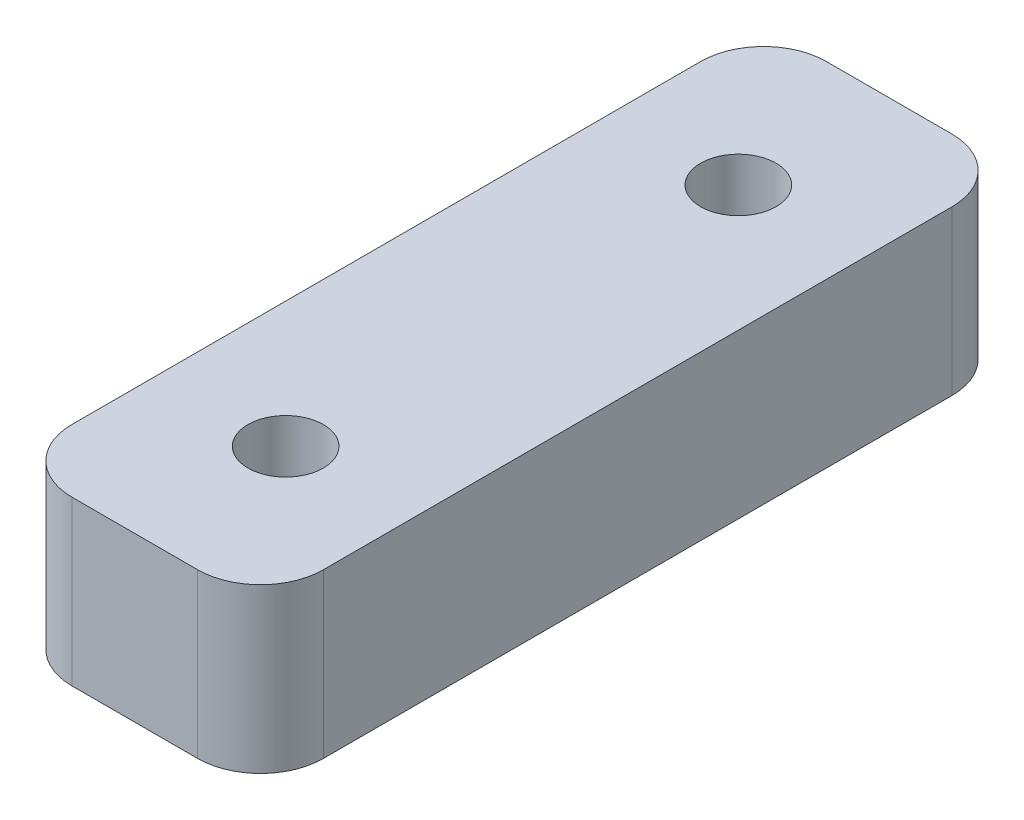
ISO-10303-21;
HEADER;
FILE_DESCRIPTION(('STEP AP214'),'2;1');
FILE_NAME('part.step','',(''),(''),'','','');
FILE_SCHEMA(('AUTOMOTIVE_DESIGN { 1 0 10303 214 1 1 1 1 }'));
ENDSEC;
DATA;
#1=APPLICATION_CONTEXT('core data for automotive mechanical design processes');
#2=APPLICATION_PROTOCOL_DEFINITION('international standard','automotive_design',2000,#1);
#3=PRODUCT_CONTEXT('',#1,'mechanical');
#4=PRODUCT('Part','Part','',(#3));
#5=PRODUCT_RELATED_PRODUCT_CATEGORY('part','',(#4));
#6=PRODUCT_DEFINITION_FORMATION('','',#4);
#7=PRODUCT_DEFINITION_CONTEXT('part definition',#1,'design');
#8=PRODUCT_DEFINITION('design','',#6,#7);
#9=PRODUCT_DEFINITION_SHAPE('','',#8);
#10=(LENGTH_UNIT() NAMED_UNIT(*) SI_UNIT(.MILLI.,.METRE.));
#11=(NAMED_UNIT(*) PLANE_ANGLE_UNIT() SI_UNIT($,.RADIAN.));
#12=(NAMED_UNIT(*) SI_UNIT($,.STERADIAN.) SOLID_ANGLE_UNIT());
#13=UNCERTAINTY_MEASURE_WITH_UNIT(LENGTH_MEASURE(1.E-05),#10,'distance_accuracy_value','');
#14=(GEOMETRIC_REPRESENTATION_CONTEXT(3) GLOBAL_UNCERTAINTY_ASSIGNED_CONTEXT((#13)) GLOBAL_UNIT_ASSIGNED_CONTEXT((#10,
#11,#12)) REPRESENTATION_CONTEXT('',''));
#15=CARTESIAN_POINT('',(0.,0.,0.));
#16=DIRECTION('',(0.,0.,1.));
#17=DIRECTION('',(1.,0.,0.));
#18=AXIS2_PLACEMENT_3D('',#15,#16,#17);
#19=CARTESIAN_POINT('',(15.,13.,-5.));
#20=DIRECTION('',(0.,-1.,0.));
#21=DIRECTION('',(0.,0.,-1.));
#22=AXIS2_PLACEMENT_3D('',#19,#20,#21);
#23=CYLINDRICAL_SURFACE('',#22,5.);
#24=CARTESIAN_POINT('',(15.,0.,-5.));
#25=DIRECTION('',(0.,1.,0.));
#26=DIRECTION('',(0.,0.,1.));
#27=AXIS2_PLACEMENT_3D('',#24,#25,#26);
#28=CIRCLE('',#27,5.);
#29=CARTESIAN_POINT('',(15.,0.,0.));
#30=VERTEX_POINT('',#29);
#31=CARTESIAN_POINT('',(20.,0.,-5.00000000000004));
#32=VERTEX_POINT('',#31);
#33=EDGE_CURVE('E140',#30,#32,#28,.T.);
#34=ORIENTED_EDGE('',*,*,#33,.T.);
#35=DIRECTION('',(0.,-1.,0.));
#36=VECTOR('',#35,1.);
#37=CARTESIAN_POINT('',(20.,13.,-5.00000000000004));
#38=LINE('',#37,#36);
#39=CARTESIAN_POINT('',(20.,13.,-5.00000000000004));
#40=VERTEX_POINT('',#39);
#41=EDGE_CURVE('E11',#40,#32,#38,.T.);
#42=ORIENTED_EDGE('',*,*,#41,.F.);
#43=CARTESIAN_POINT('',(15.,13.,-5.));
#44=DIRECTION('',(0.,1.,0.));
#45=DIRECTION('',(0.,0.,1.));
#46=AXIS2_PLACEMENT_3D('',#43,#44,#45);
#47=CIRCLE('',#46,5.);
#48=CARTESIAN_POINT('',(15.,13.,0.));
#49=VERTEX_POINT('',#48);
#50=EDGE_CURVE('E163',#49,#40,#47,.T.);
#51=ORIENTED_EDGE('',*,*,#50,.F.);
#52=DIRECTION('',(0.,-1.,0.));
#53=VECTOR('',#52,1.);
#54=CARTESIAN_POINT('',(15.,13.,0.));
#55=LINE('',#54,#53);
#56=EDGE_CURVE('E136',#49,#30,#55,.T.);
#57=ORIENTED_EDGE('',*,*,#56,.T.);
#58=EDGE_LOOP('',(#34,#42,#51,#57));
#59=FACE_BOUND('',#58,.T.);
#60=ADVANCED_FACE('F39',(#59),#23,.T.);
#61=CARTESIAN_POINT('',(20.,13.,-5.00000000000004));
#62=DIRECTION('',(-1.,0.,0.));
#63=DIRECTION('',(0.,0.,1.));
#64=AXIS2_PLACEMENT_3D('',#61,#62,#63);
#65=PLANE('',#64);
#66=DIRECTION('',(0.,0.,-1.));
#67=VECTOR('',#66,1.);
#68=CARTESIAN_POINT('',(20.,0.,-5.00000000000004));
#69=LINE('',#68,#67);
#70=CARTESIAN_POINT('',(20.,0.,-55.));
#71=VERTEX_POINT('',#70);
#72=EDGE_CURVE('E144',#32,#71,#69,.T.);
#73=ORIENTED_EDGE('',*,*,#72,.T.);
#74=DIRECTION('',(0.,-1.,0.));
#75=VECTOR('',#74,1.);
#76=CARTESIAN_POINT('',(20.,13.,-55.));
#77=LINE('',#76,#75);
#78=CARTESIAN_POINT('',(20.,13.,-55.));
#79=VERTEX_POINT('',#78);
#80=EDGE_CURVE('E48',#79,#71,#77,.T.);
#81=ORIENTED_EDGE('',*,*,#80,.F.);
#82=DIRECTION('',(0.,0.,-1.));
#83=VECTOR('',#82,1.);
#84=CARTESIAN_POINT('',(20.,13.,-5.00000000000004));
#85=LINE('',#84,#83);
#86=EDGE_CURVE('E99',#40,#79,#85,.T.);
#87=ORIENTED_EDGE('',*,*,#86,.F.);
#88=ORIENTED_EDGE('',*,*,#41,.T.);
#89=EDGE_LOOP('',(#73,#81,#87,#88));
#90=FACE_BOUND('',#89,.T.);
#91=ADVANCED_FACE('F245',(#90),#65,.F.);
#92=CARTESIAN_POINT('',(15.,13.,-55.));
#93=DIRECTION('',(0.,-1.,0.));
#94=DIRECTION('',(0.,0.,-1.));
#95=AXIS2_PLACEMENT_3D('',#92,#93,#94);
#96=CYLINDRICAL_SURFACE('',#95,5.);
#97=CARTESIAN_POINT('',(15.,0.,-55.));
#98=DIRECTION('',(0.,1.,0.));
#99=DIRECTION('',(0.,0.,-1.));
#100=AXIS2_PLACEMENT_3D('',#97,#98,#99);
#101=CIRCLE('',#100,5.);
#102=CARTESIAN_POINT('',(15.,0.,-60.));
#103=VERTEX_POINT('',#102);
#104=EDGE_CURVE('E148',#71,#103,#101,.T.);
#105=ORIENTED_EDGE('',*,*,#104,.T.);
#106=DIRECTION('',(0.,-1.,0.));
#107=VECTOR('',#106,1.);
#108=CARTESIAN_POINT('',(15.,13.,-60.));
#109=LINE('',#108,#107);
#110=CARTESIAN_POINT('',(15.,13.,-60.));
#111=VERTEX_POINT('',#110);
#112=EDGE_CURVE('E174',#111,#103,#109,.T.);
#113=ORIENTED_EDGE('',*,*,#112,.F.);
#114=CARTESIAN_POINT('',(15.,13.,-55.));
#115=DIRECTION('',(0.,1.,0.));
#116=DIRECTION('',(0.,0.,-1.));
#117=AXIS2_PLACEMENT_3D('',#114,#115,#116);
#118=CIRCLE('',#117,5.);
#119=EDGE_CURVE('E184',#79,#111,#118,.T.);
#120=ORIENTED_EDGE('',*,*,#119,.F.);
#121=ORIENTED_EDGE('',*,*,#80,.T.);
#122=EDGE_LOOP('',(#105,#113,#120,#121));
#123=FACE_BOUND('',#122,.T.);
#124=ADVANCED_FACE('F182',(#123),#96,.T.);
#125=CARTESIAN_POINT('',(5.00000000000004,13.,-60.));
#126=DIRECTION('',(0.,0.,1.));
#127=DIRECTION('',(1.,0.,0.));
#128=AXIS2_PLACEMENT_3D('',#125,#126,#127);
#129=PLANE('',#128);
#130=DIRECTION('',(-1.,0.,0.));
#131=VECTOR('',#130,1.);
#132=CARTESIAN_POINT('',(5.00000000000004,0.,-60.));
#133=LINE('',#132,#131);
#134=CARTESIAN_POINT('',(5.,0.,-60.));
#135=VERTEX_POINT('',#134);
#136=EDGE_CURVE('E151',#103,#135,#133,.T.);
#137=ORIENTED_EDGE('',*,*,#136,.T.);
#138=DIRECTION('',(0.,-1.,0.));
#139=VECTOR('',#138,1.);
#140=CARTESIAN_POINT('',(5.,13.,-60.));
#141=LINE('',#140,#139);
#142=CARTESIAN_POINT('',(5.,13.,-60.));
#143=VERTEX_POINT('',#142);
#144=EDGE_CURVE('E170',#143,#135,#141,.T.);
#145=ORIENTED_EDGE('',*,*,#144,.F.);
#146=DIRECTION('',(-1.,0.,0.));
#147=VECTOR('',#146,1.);
#148=CARTESIAN_POINT('',(5.00000000000004,13.,-60.));
#149=LINE('',#148,#147);
#150=EDGE_CURVE('E197',#111,#143,#149,.T.);
#151=ORIENTED_EDGE('',*,*,#150,.F.);
#152=ORIENTED_EDGE('',*,*,#112,.T.);
#153=EDGE_LOOP('',(#137,#145,#151,#152));
#154=FACE_BOUND('',#153,.T.);
#155=ADVANCED_FACE('F192',(#154),#129,.F.);
#156=CARTESIAN_POINT('',(5.,13.,-55.));
#157=DIRECTION('',(0.,-1.,0.));
#158=DIRECTION('',(0.,0.,-1.));
#159=AXIS2_PLACEMENT_3D('',#156,#157,#158);
#160=CYLINDRICAL_SURFACE('',#159,5.);
#161=CARTESIAN_POINT('',(5.,0.,-55.));
#162=DIRECTION('',(0.,1.,0.));
#163=DIRECTION('',(0.,0.,-1.));
#164=AXIS2_PLACEMENT_3D('',#161,#162,#163);
#165=CIRCLE('',#164,5.);
#166=CARTESIAN_POINT('',(0.,0.,-55.));
#167=VERTEX_POINT('',#166);
#168=EDGE_CURVE('E154',#135,#167,#165,.T.);
#169=ORIENTED_EDGE('',*,*,#168,.T.);
#170=DIRECTION('',(0.,-1.,0.));
#171=VECTOR('',#170,1.);
#172=CARTESIAN_POINT('',(0.,13.,-55.));
#173=LINE('',#172,#171);
#174=CARTESIAN_POINT('',(0.,13.,-55.));
#175=VERTEX_POINT('',#174);
#176=EDGE_CURVE('E129',#175,#167,#173,.T.);
#177=ORIENTED_EDGE('',*,*,#176,.F.);
#178=CARTESIAN_POINT('',(5.,13.,-55.));
#179=DIRECTION('',(0.,1.,0.));
#180=DIRECTION('',(0.,0.,-1.));
#181=AXIS2_PLACEMENT_3D('',#178,#179,#180);
#182=CIRCLE('',#181,5.);
#183=EDGE_CURVE('E118',#143,#175,#182,.T.);
#184=ORIENTED_EDGE('',*,*,#183,.F.);
#185=ORIENTED_EDGE('',*,*,#144,.T.);
#186=EDGE_LOOP('',(#169,#177,#184,#185));
#187=FACE_BOUND('',#186,.T.);
#188=ADVANCED_FACE('F195',(#187),#160,.T.);
#189=CARTESIAN_POINT('',(0.,13.,-5.00000000000004));
#190=DIRECTION('',(1.,0.,0.));
#191=DIRECTION('',(0.,0.,-1.));
#192=AXIS2_PLACEMENT_3D('',#189,#190,#191);
#193=PLANE('',#192);
#194=DIRECTION('',(0.,0.,1.));
#195=VECTOR('',#194,1.);
#196=CARTESIAN_POINT('',(0.,0.,-5.00000000000004));
#197=LINE('',#196,#195);
#198=CARTESIAN_POINT('',(0.,0.,-5.00000000000003));
#199=VERTEX_POINT('',#198);
#200=EDGE_CURVE('E127',#167,#199,#197,.T.);
#201=ORIENTED_EDGE('',*,*,#200,.T.);
#202=DIRECTION('',(0.,-1.,0.));
#203=VECTOR('',#202,1.);
#204=CARTESIAN_POINT('',(0.,13.,-5.00000000000003));
#205=LINE('',#204,#203);
#206=CARTESIAN_POINT('',(0.,13.,-5.00000000000003));
#207=VERTEX_POINT('',#206);
#208=EDGE_CURVE('E124',#207,#199,#205,.T.);
#209=ORIENTED_EDGE('',*,*,#208,.F.);
#210=DIRECTION('',(0.,0.,1.));
#211=VECTOR('',#210,1.);
#212=CARTESIAN_POINT('',(0.,13.,-5.00000000000004));
#213=LINE('',#212,#211);
#214=EDGE_CURVE('E112',#175,#207,#213,.T.);
#215=ORIENTED_EDGE('',*,*,#214,.F.);
#216=ORIENTED_EDGE('',*,*,#176,.T.);
#217=EDGE_LOOP('',(#201,#209,#215,#216));
#218=FACE_BOUND('',#217,.T.);
#219=ADVANCED_FACE('F125',(#218),#193,.F.);
#220=CARTESIAN_POINT('',(5.,13.,-5.));
#221=DIRECTION('',(0.,-1.,0.));
#222=DIRECTION('',(0.,0.,-1.));
#223=AXIS2_PLACEMENT_3D('',#220,#221,#222);
#224=CYLINDRICAL_SURFACE('',#223,5.);
#225=CARTESIAN_POINT('',(5.,0.,-5.));
#226=DIRECTION('',(0.,1.,0.));
#227=DIRECTION('',(0.,0.,-1.));
#228=AXIS2_PLACEMENT_3D('',#225,#226,#227);
#229=CIRCLE('',#228,5.);
#230=CARTESIAN_POINT('',(5.00000000000004,0.,0.));
#231=VERTEX_POINT('',#230);
#232=EDGE_CURVE('E85',#199,#231,#229,.T.);
#233=ORIENTED_EDGE('',*,*,#232,.T.);
#234=DIRECTION('',(0.,-1.,0.));
#235=VECTOR('',#234,1.);
#236=CARTESIAN_POINT('',(5.00000000000004,13.,0.));
#237=LINE('',#236,#235);
#238=CARTESIAN_POINT('',(5.00000000000004,13.,0.));
#239=VERTEX_POINT('',#238);
#240=EDGE_CURVE('E130',#239,#231,#237,.T.);
#241=ORIENTED_EDGE('',*,*,#240,.F.);
#242=CARTESIAN_POINT('',(5.,13.,-5.));
#243=DIRECTION('',(0.,1.,0.));
#244=DIRECTION('',(0.,0.,-1.));
#245=AXIS2_PLACEMENT_3D('',#242,#243,#244);
#246=CIRCLE('',#245,5.);
#247=EDGE_CURVE('E116',#207,#239,#246,.T.);
#248=ORIENTED_EDGE('',*,*,#247,.F.);
#249=ORIENTED_EDGE('',*,*,#208,.T.);
#250=EDGE_LOOP('',(#233,#241,#248,#249));
#251=FACE_BOUND('',#250,.T.);
#252=ADVANCED_FACE('F132',(#251),#224,.T.);
#253=CARTESIAN_POINT('',(5.00000000000004,13.,0.));
#254=DIRECTION('',(0.,0.,-1.));
#255=DIRECTION('',(-1.,0.,0.));
#256=AXIS2_PLACEMENT_3D('',#253,#254,#255);
#257=PLANE('',#256);
#258=DIRECTION('',(1.,0.,0.));
#259=VECTOR('',#258,1.);
#260=CARTESIAN_POINT('',(5.00000000000004,0.,0.));
#261=LINE('',#260,#259);
#262=EDGE_CURVE('E91',#231,#30,#261,.T.);
#263=ORIENTED_EDGE('',*,*,#262,.T.);
#264=ORIENTED_EDGE('',*,*,#56,.F.);
#265=DIRECTION('',(1.,0.,0.));
#266=VECTOR('',#265,1.);
#267=CARTESIAN_POINT('',(5.00000000000004,13.,0.));
#268=LINE('',#267,#266);
#269=EDGE_CURVE('E56',#239,#49,#268,.T.);
#270=ORIENTED_EDGE('',*,*,#269,.F.);
#271=ORIENTED_EDGE('',*,*,#240,.T.);
#272=EDGE_LOOP('',(#263,#264,#270,#271));
#273=FACE_BOUND('',#272,.T.);
#274=ADVANCED_FACE('F227',(#273),#257,.F.);
#275=CARTESIAN_POINT('',(15.,13.,-5.));
#276=DIRECTION('',(0.,1.,0.));
#277=DIRECTION('',(0.,0.,1.));
#278=AXIS2_PLACEMENT_3D('',#275,#276,#277);
#279=PLANE('',#278);
#280=CARTESIAN_POINT('',(10.,13.,-12.));
#281=DIRECTION('',(0.,1.,0.));
#282=DIRECTION('',(0.,0.,1.));
#283=AXIS2_PLACEMENT_3D('',#280,#281,#282);
#284=CIRCLE('',#283,3.);
#285=CARTESIAN_POINT('',(10.,13.,-9.00000000000001));
#286=VERTEX_POINT('',#285);
#287=EDGE_CURVE('E218',#286,#286,#284,.T.);
#288=ORIENTED_EDGE('',*,*,#287,.F.);
#289=EDGE_LOOP('',(#288));
#290=FACE_BOUND('',#289,.T.);
#291=CARTESIAN_POINT('',(10.,13.,-48.));
#292=DIRECTION('',(0.,1.,0.));
#293=DIRECTION('',(0.,0.,1.));
#294=AXIS2_PLACEMENT_3D('',#291,#292,#293);
#295=CIRCLE('',#294,3.);
#296=CARTESIAN_POINT('',(10.,13.,-45.));
#297=VERTEX_POINT('',#296);
#298=EDGE_CURVE('E210',#297,#297,#295,.T.);
#299=ORIENTED_EDGE('',*,*,#298,.F.);
#300=EDGE_LOOP('',(#299));
#301=FACE_BOUND('',#300,.T.);
#302=ORIENTED_EDGE('',*,*,#50,.T.);
#303=ORIENTED_EDGE('',*,*,#86,.T.);
#304=ORIENTED_EDGE('',*,*,#119,.T.);
#305=ORIENTED_EDGE('',*,*,#150,.T.);
#306=ORIENTED_EDGE('',*,*,#183,.T.);
#307=ORIENTED_EDGE('',*,*,#214,.T.);
#308=ORIENTED_EDGE('',*,*,#247,.T.);
#309=ORIENTED_EDGE('',*,*,#269,.T.);
#310=EDGE_LOOP('',(#302,#303,#304,#305,#306,#307,#308,#309));
#311=FACE_BOUND('',#310,.T.);
#312=ADVANCED_FACE('F114',(#290,#301,#311),#279,.T.);
#313=CARTESIAN_POINT('',(15.,0.,-5.));
#314=DIRECTION('',(0.,1.,0.));
#315=DIRECTION('',(0.,0.,1.));
#316=AXIS2_PLACEMENT_3D('',#313,#314,#315);
#317=PLANE('',#316);
#318=CARTESIAN_POINT('',(10.,0.,-12.));
#319=DIRECTION('',(0.,1.,0.));
#320=DIRECTION('',(0.,0.,1.));
#321=AXIS2_PLACEMENT_3D('',#318,#319,#320);
#322=CIRCLE('',#321,3.);
#323=CARTESIAN_POINT('',(10.,0.,-9.00000000000001));
#324=VERTEX_POINT('',#323);
#325=EDGE_CURVE('E214',#324,#324,#322,.T.);
#326=ORIENTED_EDGE('',*,*,#325,.T.);
#327=EDGE_LOOP('',(#326));
#328=FACE_BOUND('',#327,.T.);
#329=CARTESIAN_POINT('',(10.,0.,-48.));
#330=DIRECTION('',(0.,1.,0.));
#331=DIRECTION('',(0.,0.,1.));
#332=AXIS2_PLACEMENT_3D('',#329,#330,#331);
#333=CIRCLE('',#332,3.);
#334=CARTESIAN_POINT('',(10.,0.,-45.));
#335=VERTEX_POINT('',#334);
#336=EDGE_CURVE('E145',#335,#335,#333,.T.);
#337=ORIENTED_EDGE('',*,*,#336,.T.);
#338=EDGE_LOOP('',(#337));
#339=FACE_BOUND('',#338,.T.);
#340=ORIENTED_EDGE('',*,*,#33,.F.);
#341=ORIENTED_EDGE('',*,*,#262,.F.);
#342=ORIENTED_EDGE('',*,*,#232,.F.);
#343=ORIENTED_EDGE('',*,*,#200,.F.);
#344=ORIENTED_EDGE('',*,*,#168,.F.);
#345=ORIENTED_EDGE('',*,*,#136,.F.);
#346=ORIENTED_EDGE('',*,*,#104,.F.);
#347=ORIENTED_EDGE('',*,*,#72,.F.);
#348=EDGE_LOOP('',(#340,#341,#342,#343,#344,#345,#346,#347));
#349=FACE_BOUND('',#348,.T.);
#350=ADVANCED_FACE('F188',(#328,#339,#349),#317,.F.);
#351=CARTESIAN_POINT('',(10.,13.,-48.));
#352=DIRECTION('',(0.,1.,0.));
#353=DIRECTION('',(0.,0.,1.));
#354=AXIS2_PLACEMENT_3D('',#351,#352,#353);
#355=CYLINDRICAL_SURFACE('',#354,3.);
#356=ORIENTED_EDGE('',*,*,#336,.F.);
#357=EDGE_LOOP('',(#356));
#358=FACE_BOUND('',#357,.T.);
#359=ORIENTED_EDGE('',*,*,#298,.T.);
#360=EDGE_LOOP('',(#359));
#361=FACE_BOUND('',#360,.T.);
#362=ADVANCED_FACE('F231',(#358,#361),#355,.F.);
#363=CARTESIAN_POINT('',(10.,13.,-12.));
#364=DIRECTION('',(0.,1.,0.));
#365=DIRECTION('',(0.,0.,1.));
#366=AXIS2_PLACEMENT_3D('',#363,#364,#365);
#367=CYLINDRICAL_SURFACE('',#366,3.);
#368=ORIENTED_EDGE('',*,*,#325,.F.);
#369=EDGE_LOOP('',(#368));
#370=FACE_BOUND('',#369,.T.);
#371=ORIENTED_EDGE('',*,*,#287,.T.);
#372=EDGE_LOOP('',(#371));
#373=FACE_BOUND('',#372,.T.);
#374=ADVANCED_FACE('F223',(#370,#373),#367,.F.);
#375=CLOSED_SHELL('',(#60,#91,#124,#155,#188,#219,#252,#274,#312,#350,#362,#374));
#376=MANIFOLD_SOLID_BREP('B2',#375);
#377=ADVANCED_BREP_SHAPE_REPRESENTATION('',(#18,#376),#14);
#378=SHAPE_DEFINITION_REPRESENTATION(#9,#377);
ENDSEC;
END-ISO-10303-21;
